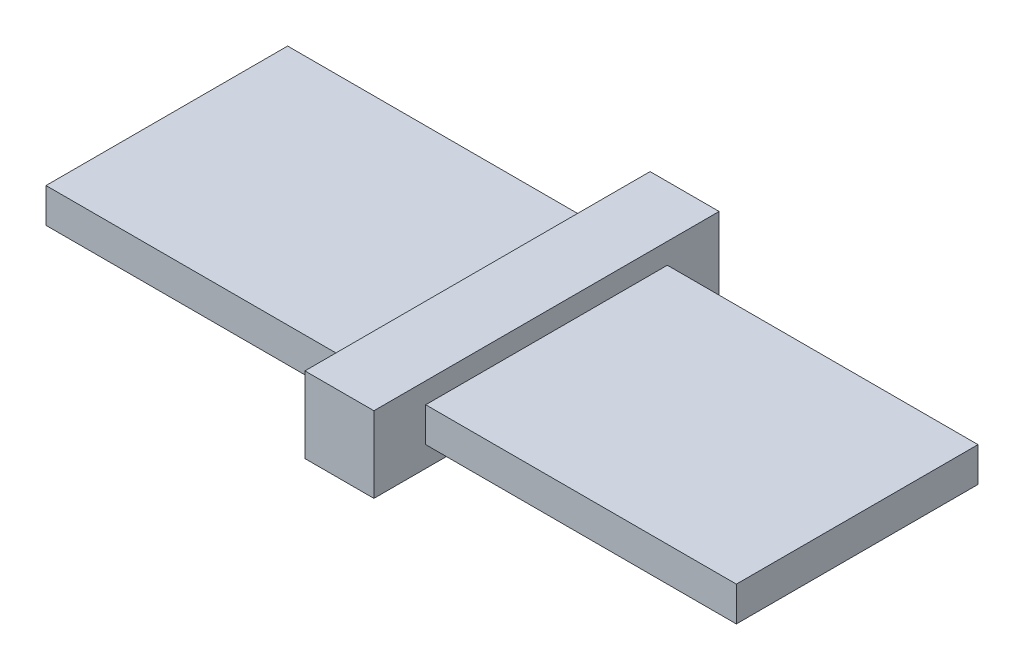
ISO-10303-21;
HEADER;
FILE_DESCRIPTION(('STEP AP214'),'2;1');
FILE_NAME('part.step','',(''),(''),'','','');
FILE_SCHEMA(('AUTOMOTIVE_DESIGN { 1 0 10303 214 1 1 1 1 }'));
ENDSEC;
DATA;
#1=APPLICATION_CONTEXT('core data for automotive mechanical design processes');
#2=APPLICATION_PROTOCOL_DEFINITION('international standard','automotive_design',2000,#1);
#3=PRODUCT_CONTEXT('',#1,'mechanical');
#4=PRODUCT('Part','Part','',(#3));
#5=PRODUCT_RELATED_PRODUCT_CATEGORY('part','',(#4));
#6=PRODUCT_DEFINITION_FORMATION('','',#4);
#7=PRODUCT_DEFINITION_CONTEXT('part definition',#1,'design');
#8=PRODUCT_DEFINITION('design','',#6,#7);
#9=PRODUCT_DEFINITION_SHAPE('','',#8);
#10=(LENGTH_UNIT() NAMED_UNIT(*) SI_UNIT(.MILLI.,.METRE.));
#11=(NAMED_UNIT(*) PLANE_ANGLE_UNIT() SI_UNIT($,.RADIAN.));
#12=(NAMED_UNIT(*) SI_UNIT($,.STERADIAN.) SOLID_ANGLE_UNIT());
#13=UNCERTAINTY_MEASURE_WITH_UNIT(LENGTH_MEASURE(1.E-05),#10,'distance_accuracy_value','');
#14=(GEOMETRIC_REPRESENTATION_CONTEXT(3) GLOBAL_UNCERTAINTY_ASSIGNED_CONTEXT((#13)) GLOBAL_UNIT_ASSIGNED_CONTEXT((#10,
#11,#12)) REPRESENTATION_CONTEXT('',''));
#15=CARTESIAN_POINT('',(0.,0.,0.));
#16=DIRECTION('',(0.,0.,1.));
#17=DIRECTION('',(1.,0.,0.));
#18=AXIS2_PLACEMENT_3D('',#15,#16,#17);
#19=CARTESIAN_POINT('',(-50.,5.,-17.5));
#20=DIRECTION('',(0.,0.,1.));
#21=DIRECTION('',(1.,0.,0.));
#22=AXIS2_PLACEMENT_3D('',#19,#20,#21);
#23=PLANE('',#22);
#24=DIRECTION('',(0.,-1.,0.));
#25=VECTOR('',#24,1.);
#26=CARTESIAN_POINT('',(5.,5.,-17.5));
#27=LINE('',#26,#25);
#28=CARTESIAN_POINT('',(5.,5.,-17.5));
#29=VERTEX_POINT('',#28);
#30=CARTESIAN_POINT('',(5.,0.,-17.5));
#31=VERTEX_POINT('',#30);
#32=EDGE_CURVE('E163',#29,#31,#27,.T.);
#33=ORIENTED_EDGE('',*,*,#32,.F.);
#34=DIRECTION('',(-1.,0.,0.));
#35=VECTOR('',#34,1.);
#36=CARTESIAN_POINT('',(-50.,5.,-17.5));
#37=LINE('',#36,#35);
#38=CARTESIAN_POINT('',(50.,5.,-17.5));
#39=VERTEX_POINT('',#38);
#40=EDGE_CURVE('E173',#39,#29,#37,.T.);
#41=ORIENTED_EDGE('',*,*,#40,.F.);
#42=DIRECTION('',(0.,-1.,0.));
#43=VECTOR('',#42,1.);
#44=CARTESIAN_POINT('',(50.,5.,-17.5));
#45=LINE('',#44,#43);
#46=CARTESIAN_POINT('',(50.,0.,-17.5));
#47=VERTEX_POINT('',#46);
#48=EDGE_CURVE('E200',#39,#47,#45,.T.);
#49=ORIENTED_EDGE('',*,*,#48,.T.);
#50=DIRECTION('',(-1.,0.,0.));
#51=VECTOR('',#50,1.);
#52=CARTESIAN_POINT('',(-50.,0.,-17.5));
#53=LINE('',#52,#51);
#54=EDGE_CURVE('E185',#47,#31,#53,.T.);
#55=ORIENTED_EDGE('',*,*,#54,.T.);
#56=EDGE_LOOP('',(#33,#41,#49,#55));
#57=FACE_BOUND('',#56,.T.);
#58=ADVANCED_FACE('F34',(#57),#23,.F.);
#59=CARTESIAN_POINT('',(-50.,5.,17.5));
#60=DIRECTION('',(0.,0.,-1.));
#61=DIRECTION('',(-1.,0.,0.));
#62=AXIS2_PLACEMENT_3D('',#59,#60,#61);
#63=PLANE('',#62);
#64=DIRECTION('',(0.,1.,0.));
#65=VECTOR('',#64,1.);
#66=CARTESIAN_POINT('',(5.,5.,17.5));
#67=LINE('',#66,#65);
#68=CARTESIAN_POINT('',(5.,0.,17.5));
#69=VERTEX_POINT('',#68);
#70=CARTESIAN_POINT('',(5.,5.,17.5));
#71=VERTEX_POINT('',#70);
#72=EDGE_CURVE('E161',#69,#71,#67,.T.);
#73=ORIENTED_EDGE('',*,*,#72,.F.);
#74=DIRECTION('',(1.,0.,0.));
#75=VECTOR('',#74,1.);
#76=CARTESIAN_POINT('',(-50.,0.,17.5));
#77=LINE('',#76,#75);
#78=CARTESIAN_POINT('',(50.,0.,17.5));
#79=VERTEX_POINT('',#78);
#80=EDGE_CURVE('E190',#69,#79,#77,.T.);
#81=ORIENTED_EDGE('',*,*,#80,.T.);
#82=DIRECTION('',(0.,-1.,0.));
#83=VECTOR('',#82,1.);
#84=CARTESIAN_POINT('',(50.,5.,17.5));
#85=LINE('',#84,#83);
#86=CARTESIAN_POINT('',(50.,5.,17.5));
#87=VERTEX_POINT('',#86);
#88=EDGE_CURVE('E181',#87,#79,#85,.T.);
#89=ORIENTED_EDGE('',*,*,#88,.F.);
#90=DIRECTION('',(1.,0.,0.));
#91=VECTOR('',#90,1.);
#92=CARTESIAN_POINT('',(-50.,5.,17.5));
#93=LINE('',#92,#91);
#94=EDGE_CURVE('E178',#71,#87,#93,.T.);
#95=ORIENTED_EDGE('',*,*,#94,.F.);
#96=EDGE_LOOP('',(#73,#81,#89,#95));
#97=FACE_BOUND('',#96,.T.);
#98=ADVANCED_FACE('F232',(#97),#63,.F.);
#99=CARTESIAN_POINT('',(0.,5.,0.));
#100=DIRECTION('',(0.,-1.,0.));
#101=DIRECTION('',(0.,0.,-1.));
#102=AXIS2_PLACEMENT_3D('',#99,#100,#101);
#103=PLANE('',#102);
#104=DIRECTION('',(0.,0.,-1.));
#105=VECTOR('',#104,1.);
#106=CARTESIAN_POINT('',(5.,5.,0.));
#107=LINE('',#106,#105);
#108=EDGE_CURVE('E165',#71,#29,#107,.T.);
#109=ORIENTED_EDGE('',*,*,#108,.F.);
#110=ORIENTED_EDGE('',*,*,#94,.T.);
#111=DIRECTION('',(0.,0.,-1.));
#112=VECTOR('',#111,1.);
#113=CARTESIAN_POINT('',(50.,5.,17.5));
#114=LINE('',#113,#112);
#115=EDGE_CURVE('E168',#87,#39,#114,.T.);
#116=ORIENTED_EDGE('',*,*,#115,.T.);
#117=ORIENTED_EDGE('',*,*,#40,.T.);
#118=EDGE_LOOP('',(#109,#110,#116,#117));
#119=FACE_BOUND('',#118,.T.);
#120=ADVANCED_FACE('F221',(#119),#103,.F.);
#121=CARTESIAN_POINT('',(0.,0.,0.));
#122=DIRECTION('',(0.,-1.,0.));
#123=DIRECTION('',(0.,0.,-1.));
#124=AXIS2_PLACEMENT_3D('',#121,#122,#123);
#125=PLANE('',#124);
#126=ORIENTED_EDGE('',*,*,#80,.F.);
#127=DIRECTION('',(0.,0.,-1.));
#128=VECTOR('',#127,1.);
#129=CARTESIAN_POINT('',(5.,0.,0.));
#130=LINE('',#129,#128);
#131=EDGE_CURVE('E11',#69,#31,#130,.T.);
#132=ORIENTED_EDGE('',*,*,#131,.T.);
#133=ORIENTED_EDGE('',*,*,#54,.F.);
#134=DIRECTION('',(0.,0.,-1.));
#135=VECTOR('',#134,1.);
#136=CARTESIAN_POINT('',(50.,0.,17.5));
#137=LINE('',#136,#135);
#138=EDGE_CURVE('E167',#79,#47,#137,.T.);
#139=ORIENTED_EDGE('',*,*,#138,.F.);
#140=EDGE_LOOP('',(#126,#132,#133,#139));
#141=FACE_BOUND('',#140,.T.);
#142=ADVANCED_FACE('F227',(#141),#125,.T.);
#143=CARTESIAN_POINT('',(50.,5.,17.5));
#144=DIRECTION('',(-1.,0.,0.));
#145=DIRECTION('',(0.,0.,1.));
#146=AXIS2_PLACEMENT_3D('',#143,#144,#145);
#147=PLANE('',#146);
#148=ORIENTED_EDGE('',*,*,#138,.T.);
#149=ORIENTED_EDGE('',*,*,#48,.F.);
#150=ORIENTED_EDGE('',*,*,#115,.F.);
#151=ORIENTED_EDGE('',*,*,#88,.T.);
#152=EDGE_LOOP('',(#148,#149,#150,#151));
#153=FACE_BOUND('',#152,.T.);
#154=ADVANCED_FACE('F36',(#153),#147,.F.);
#155=CARTESIAN_POINT('',(5.,0.,0.));
#156=DIRECTION('',(-1.,0.,0.));
#157=DIRECTION('',(0.,0.,1.));
#158=AXIS2_PLACEMENT_3D('',#155,#156,#157);
#159=PLANE('',#158);
#160=DIRECTION('',(0.,1.,0.));
#161=VECTOR('',#160,1.);
#162=CARTESIAN_POINT('',(5.,-3.,-25.));
#163=LINE('',#162,#161);
#164=CARTESIAN_POINT('',(5.,-3.,-25.));
#165=VERTEX_POINT('',#164);
#166=CARTESIAN_POINT('',(5.,8.,-25.));
#167=VERTEX_POINT('',#166);
#168=EDGE_CURVE('E136',#165,#167,#163,.T.);
#169=ORIENTED_EDGE('',*,*,#168,.T.);
#170=DIRECTION('',(0.,0.,1.));
#171=VECTOR('',#170,1.);
#172=CARTESIAN_POINT('',(5.,8.,25.));
#173=LINE('',#172,#171);
#174=CARTESIAN_POINT('',(5.,8.,25.));
#175=VERTEX_POINT('',#174);
#176=EDGE_CURVE('E125',#167,#175,#173,.T.);
#177=ORIENTED_EDGE('',*,*,#176,.T.);
#178=DIRECTION('',(0.,-1.,0.));
#179=VECTOR('',#178,1.);
#180=CARTESIAN_POINT('',(5.,-3.,25.));
#181=LINE('',#180,#179);
#182=CARTESIAN_POINT('',(5.,-3.,25.));
#183=VERTEX_POINT('',#182);
#184=EDGE_CURVE('E135',#175,#183,#181,.T.);
#185=ORIENTED_EDGE('',*,*,#184,.T.);
#186=DIRECTION('',(0.,0.,-1.));
#187=VECTOR('',#186,1.);
#188=CARTESIAN_POINT('',(5.,-3.,25.));
#189=LINE('',#188,#187);
#190=EDGE_CURVE('E142',#183,#165,#189,.T.);
#191=ORIENTED_EDGE('',*,*,#190,.T.);
#192=EDGE_LOOP('',(#169,#177,#185,#191));
#193=FACE_BOUND('',#192,.T.);
#194=ORIENTED_EDGE('',*,*,#72,.T.);
#195=ORIENTED_EDGE('',*,*,#108,.T.);
#196=ORIENTED_EDGE('',*,*,#32,.T.);
#197=ORIENTED_EDGE('',*,*,#131,.F.);
#198=EDGE_LOOP('',(#194,#195,#196,#197));
#199=FACE_BOUND('',#198,.T.);
#200=ADVANCED_FACE('F139',(#193,#199),#159,.F.);
#201=CARTESIAN_POINT('',(-5.,0.,0.));
#202=DIRECTION('',(-1.,0.,0.));
#203=DIRECTION('',(0.,0.,1.));
#204=AXIS2_PLACEMENT_3D('',#201,#202,#203);
#205=PLANE('',#204);
#206=DIRECTION('',(0.,1.,0.));
#207=VECTOR('',#206,1.);
#208=CARTESIAN_POINT('',(-5.,-3.,-25.));
#209=LINE('',#208,#207);
#210=CARTESIAN_POINT('',(-5.,-3.,-25.));
#211=VERTEX_POINT('',#210);
#212=CARTESIAN_POINT('',(-5.,8.,-25.));
#213=VERTEX_POINT('',#212);
#214=EDGE_CURVE('E150',#211,#213,#209,.T.);
#215=ORIENTED_EDGE('',*,*,#214,.F.);
#216=DIRECTION('',(0.,0.,-1.));
#217=VECTOR('',#216,1.);
#218=CARTESIAN_POINT('',(-5.,-3.,25.));
#219=LINE('',#218,#217);
#220=CARTESIAN_POINT('',(-5.,-3.,25.));
#221=VERTEX_POINT('',#220);
#222=EDGE_CURVE('E146',#221,#211,#219,.T.);
#223=ORIENTED_EDGE('',*,*,#222,.F.);
#224=DIRECTION('',(0.,-1.,0.));
#225=VECTOR('',#224,1.);
#226=CARTESIAN_POINT('',(-5.,-3.,25.));
#227=LINE('',#226,#225);
#228=CARTESIAN_POINT('',(-5.,8.,25.));
#229=VERTEX_POINT('',#228);
#230=EDGE_CURVE('E367',#229,#221,#227,.T.);
#231=ORIENTED_EDGE('',*,*,#230,.F.);
#232=DIRECTION('',(0.,0.,1.));
#233=VECTOR('',#232,1.);
#234=CARTESIAN_POINT('',(-5.,8.,25.));
#235=LINE('',#234,#233);
#236=EDGE_CURVE('E365',#213,#229,#235,.T.);
#237=ORIENTED_EDGE('',*,*,#236,.F.);
#238=EDGE_LOOP('',(#215,#223,#231,#237));
#239=FACE_BOUND('',#238,.T.);
#240=DIRECTION('',(0.,0.,-1.));
#241=VECTOR('',#240,1.);
#242=CARTESIAN_POINT('',(-5.,5.,0.));
#243=LINE('',#242,#241);
#244=CARTESIAN_POINT('',(-5.,5.,17.5));
#245=VERTEX_POINT('',#244);
#246=CARTESIAN_POINT('',(-5.,5.,-17.5));
#247=VERTEX_POINT('',#246);
#248=EDGE_CURVE('E56',#245,#247,#243,.T.);
#249=ORIENTED_EDGE('',*,*,#248,.F.);
#250=DIRECTION('',(0.,1.,0.));
#251=VECTOR('',#250,1.);
#252=CARTESIAN_POINT('',(-5.,5.,17.5));
#253=LINE('',#252,#251);
#254=CARTESIAN_POINT('',(-5.,0.,17.5));
#255=VERTEX_POINT('',#254);
#256=EDGE_CURVE('E49',#255,#245,#253,.T.);
#257=ORIENTED_EDGE('',*,*,#256,.F.);
#258=DIRECTION('',(0.,0.,-1.));
#259=VECTOR('',#258,1.);
#260=CARTESIAN_POINT('',(-5.,0.,0.));
#261=LINE('',#260,#259);
#262=CARTESIAN_POINT('',(-5.,0.,-17.5));
#263=VERTEX_POINT('',#262);
#264=EDGE_CURVE('E42',#255,#263,#261,.T.);
#265=ORIENTED_EDGE('',*,*,#264,.T.);
#266=DIRECTION('',(0.,-1.,0.));
#267=VECTOR('',#266,1.);
#268=CARTESIAN_POINT('',(-5.,5.,-17.5));
#269=LINE('',#268,#267);
#270=EDGE_CURVE('E152',#247,#263,#269,.T.);
#271=ORIENTED_EDGE('',*,*,#270,.F.);
#272=EDGE_LOOP('',(#249,#257,#265,#271));
#273=FACE_BOUND('',#272,.T.);
#274=ADVANCED_FACE('F205',(#239,#273),#205,.T.);
#275=CARTESIAN_POINT('',(5.,-3.,-25.));
#276=DIRECTION('',(0.,0.,1.));
#277=DIRECTION('',(1.,0.,0.));
#278=AXIS2_PLACEMENT_3D('',#275,#276,#277);
#279=PLANE('',#278);
#280=ORIENTED_EDGE('',*,*,#214,.T.);
#281=DIRECTION('',(-1.,0.,0.));
#282=VECTOR('',#281,1.);
#283=CARTESIAN_POINT('',(5.,8.,-25.));
#284=LINE('',#283,#282);
#285=EDGE_CURVE('E129',#167,#213,#284,.T.);
#286=ORIENTED_EDGE('',*,*,#285,.F.);
#287=ORIENTED_EDGE('',*,*,#168,.F.);
#288=DIRECTION('',(-1.,0.,0.));
#289=VECTOR('',#288,1.);
#290=CARTESIAN_POINT('',(5.,-3.,-25.));
#291=LINE('',#290,#289);
#292=EDGE_CURVE('E374',#165,#211,#291,.T.);
#293=ORIENTED_EDGE('',*,*,#292,.T.);
#294=EDGE_LOOP('',(#280,#286,#287,#293));
#295=FACE_BOUND('',#294,.T.);
#296=ADVANCED_FACE('F148',(#295),#279,.F.);
#297=CARTESIAN_POINT('',(5.,8.,25.));
#298=DIRECTION('',(0.,-1.,0.));
#299=DIRECTION('',(0.,0.,-1.));
#300=AXIS2_PLACEMENT_3D('',#297,#298,#299);
#301=PLANE('',#300);
#302=ORIENTED_EDGE('',*,*,#236,.T.);
#303=DIRECTION('',(-1.,0.,0.));
#304=VECTOR('',#303,1.);
#305=CARTESIAN_POINT('',(5.,8.,25.));
#306=LINE('',#305,#304);
#307=EDGE_CURVE('E132',#175,#229,#306,.T.);
#308=ORIENTED_EDGE('',*,*,#307,.F.);
#309=ORIENTED_EDGE('',*,*,#176,.F.);
#310=ORIENTED_EDGE('',*,*,#285,.T.);
#311=EDGE_LOOP('',(#302,#308,#309,#310));
#312=FACE_BOUND('',#311,.T.);
#313=ADVANCED_FACE('F127',(#312),#301,.F.);
#314=CARTESIAN_POINT('',(5.,-3.,25.));
#315=DIRECTION('',(0.,0.,-1.));
#316=DIRECTION('',(-1.,0.,0.));
#317=AXIS2_PLACEMENT_3D('',#314,#315,#316);
#318=PLANE('',#317);
#319=ORIENTED_EDGE('',*,*,#230,.T.);
#320=DIRECTION('',(-1.,0.,0.));
#321=VECTOR('',#320,1.);
#322=CARTESIAN_POINT('',(5.,-3.,25.));
#323=LINE('',#322,#321);
#324=EDGE_CURVE('E154',#183,#221,#323,.T.);
#325=ORIENTED_EDGE('',*,*,#324,.F.);
#326=ORIENTED_EDGE('',*,*,#184,.F.);
#327=ORIENTED_EDGE('',*,*,#307,.T.);
#328=EDGE_LOOP('',(#319,#325,#326,#327));
#329=FACE_BOUND('',#328,.T.);
#330=ADVANCED_FACE('F266',(#329),#318,.F.);
#331=CARTESIAN_POINT('',(5.,-3.,25.));
#332=DIRECTION('',(0.,1.,0.));
#333=DIRECTION('',(0.,0.,1.));
#334=AXIS2_PLACEMENT_3D('',#331,#332,#333);
#335=PLANE('',#334);
#336=ORIENTED_EDGE('',*,*,#222,.T.);
#337=ORIENTED_EDGE('',*,*,#292,.F.);
#338=ORIENTED_EDGE('',*,*,#190,.F.);
#339=ORIENTED_EDGE('',*,*,#324,.T.);
#340=EDGE_LOOP('',(#336,#337,#338,#339));
#341=FACE_BOUND('',#340,.T.);
#342=ADVANCED_FACE('F228',(#341),#335,.F.);
#343=CARTESIAN_POINT('',(-50.,5.,17.5));
#344=DIRECTION('',(1.,0.,0.));
#345=DIRECTION('',(0.,0.,-1.));
#346=AXIS2_PLACEMENT_3D('',#343,#344,#345);
#347=PLANE('',#346);
#348=DIRECTION('',(0.,0.,1.));
#349=VECTOR('',#348,1.);
#350=CARTESIAN_POINT('',(-50.,0.,17.5));
#351=LINE('',#350,#349);
#352=CARTESIAN_POINT('',(-50.,0.,-17.5));
#353=VERTEX_POINT('',#352);
#354=CARTESIAN_POINT('',(-50.,0.,17.5));
#355=VERTEX_POINT('',#354);
#356=EDGE_CURVE('E188',#353,#355,#351,.T.);
#357=ORIENTED_EDGE('',*,*,#356,.T.);
#358=DIRECTION('',(0.,-1.,0.));
#359=VECTOR('',#358,1.);
#360=CARTESIAN_POINT('',(-50.,5.,17.5));
#361=LINE('',#360,#359);
#362=CARTESIAN_POINT('',(-50.,5.,17.5));
#363=VERTEX_POINT('',#362);
#364=EDGE_CURVE('E194',#363,#355,#361,.T.);
#365=ORIENTED_EDGE('',*,*,#364,.F.);
#366=DIRECTION('',(0.,0.,1.));
#367=VECTOR('',#366,1.);
#368=CARTESIAN_POINT('',(-50.,5.,17.5));
#369=LINE('',#368,#367);
#370=CARTESIAN_POINT('',(-50.,5.,-17.5));
#371=VERTEX_POINT('',#370);
#372=EDGE_CURVE('E176',#371,#363,#369,.T.);
#373=ORIENTED_EDGE('',*,*,#372,.F.);
#374=DIRECTION('',(0.,-1.,0.));
#375=VECTOR('',#374,1.);
#376=CARTESIAN_POINT('',(-50.,5.,-17.5));
#377=LINE('',#376,#375);
#378=EDGE_CURVE('E197',#371,#353,#377,.T.);
#379=ORIENTED_EDGE('',*,*,#378,.T.);
#380=EDGE_LOOP('',(#357,#365,#373,#379));
#381=FACE_BOUND('',#380,.T.);
#382=ADVANCED_FACE('F214',(#381),#347,.F.);
#383=EDGE_CURVE('E179',#363,#245,#93,.T.);
#384=ORIENTED_EDGE('',*,*,#383,.T.);
#385=ORIENTED_EDGE('',*,*,#248,.T.);
#386=EDGE_CURVE('E171',#247,#371,#37,.T.);
#387=ORIENTED_EDGE('',*,*,#386,.T.);
#388=ORIENTED_EDGE('',*,*,#372,.T.);
#389=EDGE_LOOP('',(#384,#385,#387,#388));
#390=FACE_BOUND('',#389,.T.);
#391=ADVANCED_FACE('F218',(#390),#103,.F.);
#392=ORIENTED_EDGE('',*,*,#264,.F.);
#393=EDGE_CURVE('E172',#355,#255,#77,.T.);
#394=ORIENTED_EDGE('',*,*,#393,.F.);
#395=ORIENTED_EDGE('',*,*,#356,.F.);
#396=EDGE_CURVE('E184',#263,#353,#53,.T.);
#397=ORIENTED_EDGE('',*,*,#396,.F.);
#398=EDGE_LOOP('',(#392,#394,#395,#397));
#399=FACE_BOUND('',#398,.T.);
#400=ADVANCED_FACE('F208',(#399),#125,.T.);
#401=ORIENTED_EDGE('',*,*,#393,.T.);
#402=ORIENTED_EDGE('',*,*,#256,.T.);
#403=ORIENTED_EDGE('',*,*,#383,.F.);
#404=ORIENTED_EDGE('',*,*,#364,.T.);
#405=EDGE_LOOP('',(#401,#402,#403,#404));
#406=FACE_BOUND('',#405,.T.);
#407=ADVANCED_FACE('F210',(#406),#63,.F.);
#408=ORIENTED_EDGE('',*,*,#386,.F.);
#409=ORIENTED_EDGE('',*,*,#270,.T.);
#410=ORIENTED_EDGE('',*,*,#396,.T.);
#411=ORIENTED_EDGE('',*,*,#378,.F.);
#412=EDGE_LOOP('',(#408,#409,#410,#411));
#413=FACE_BOUND('',#412,.T.);
#414=ADVANCED_FACE('F217',(#413),#23,.F.);
#415=CLOSED_SHELL('',(#58,#98,#120,#142,#154,#200,#274,#296,#313,#330,#342,#382,#391,#400,#407,#414));
#416=MANIFOLD_SOLID_BREP('B2',#415);
#417=ADVANCED_BREP_SHAPE_REPRESENTATION('',(#18,#416),#14);
#418=SHAPE_DEFINITION_REPRESENTATION(#9,#417);
ENDSEC;
END-ISO-10303-21;
